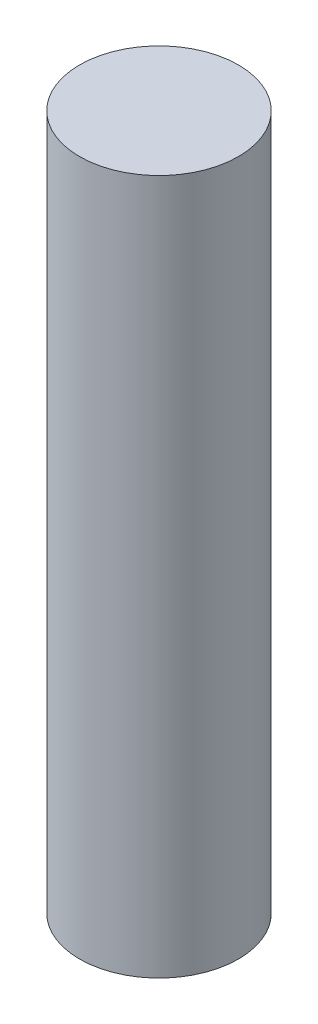
ISO-10303-21;
HEADER;
FILE_DESCRIPTION(('STEP AP214'),'2;1');
FILE_NAME('part.step','',(''),(''),'','','');
FILE_SCHEMA(('AUTOMOTIVE_DESIGN { 1 0 10303 214 1 1 1 1 }'));
ENDSEC;
DATA;
#1=APPLICATION_CONTEXT('core data for automotive mechanical design processes');
#2=APPLICATION_PROTOCOL_DEFINITION('international standard','automotive_design',2000,#1);
#3=PRODUCT_CONTEXT('',#1,'mechanical');
#4=PRODUCT('Part','Part','',(#3));
#5=PRODUCT_RELATED_PRODUCT_CATEGORY('part','',(#4));
#6=PRODUCT_DEFINITION_FORMATION('','',#4);
#7=PRODUCT_DEFINITION_CONTEXT('part definition',#1,'design');
#8=PRODUCT_DEFINITION('design','',#6,#7);
#9=PRODUCT_DEFINITION_SHAPE('','',#8);
#10=(LENGTH_UNIT() NAMED_UNIT(*) SI_UNIT(.MILLI.,.METRE.));
#11=(NAMED_UNIT(*) PLANE_ANGLE_UNIT() SI_UNIT($,.RADIAN.));
#12=(NAMED_UNIT(*) SI_UNIT($,.STERADIAN.) SOLID_ANGLE_UNIT());
#13=UNCERTAINTY_MEASURE_WITH_UNIT(LENGTH_MEASURE(1.E-05),#10,'distance_accuracy_value','');
#14=(GEOMETRIC_REPRESENTATION_CONTEXT(3) GLOBAL_UNCERTAINTY_ASSIGNED_CONTEXT((#13)) GLOBAL_UNIT_ASSIGNED_CONTEXT((#10,
#11,#12)) REPRESENTATION_CONTEXT('',''));
#15=CARTESIAN_POINT('',(0.,0.,0.));
#16=DIRECTION('',(0.,0.,1.));
#17=DIRECTION('',(1.,0.,0.));
#18=AXIS2_PLACEMENT_3D('',#15,#16,#17);
#19=CARTESIAN_POINT('',(0.,35.,0.));
#20=DIRECTION('',(0.,-1.,0.));
#21=DIRECTION('',(0.,0.,-1.));
#22=AXIS2_PLACEMENT_3D('',#19,#20,#21);
#23=CYLINDRICAL_SURFACE('',#22,4.);
#24=CARTESIAN_POINT('',(0.,35.,0.));
#25=DIRECTION('',(0.,1.,0.));
#26=DIRECTION('',(0.,0.,1.));
#27=AXIS2_PLACEMENT_3D('',#24,#25,#26);
#28=CIRCLE('',#27,4.);
#29=CARTESIAN_POINT('',(0.,35.,4.));
#30=VERTEX_POINT('',#29);
#31=EDGE_CURVE('E10',#30,#30,#28,.T.);
#32=ORIENTED_EDGE('',*,*,#31,.F.);
#33=EDGE_LOOP('',(#32));
#34=FACE_BOUND('',#33,.T.);
#35=CARTESIAN_POINT('',(0.,0.,0.));
#36=DIRECTION('',(0.,1.,0.));
#37=DIRECTION('',(0.,0.,1.));
#38=AXIS2_PLACEMENT_3D('',#35,#36,#37);
#39=CIRCLE('',#38,4.);
#40=CARTESIAN_POINT('',(0.,0.,4.));
#41=VERTEX_POINT('',#40);
#42=EDGE_CURVE('E40',#41,#41,#39,.T.);
#43=ORIENTED_EDGE('',*,*,#42,.T.);
#44=EDGE_LOOP('',(#43));
#45=FACE_BOUND('',#44,.T.);
#46=ADVANCED_FACE('F37',(#34,#45),#23,.T.);
#47=CARTESIAN_POINT('',(0.,35.,0.));
#48=DIRECTION('',(0.,1.,0.));
#49=DIRECTION('',(0.,0.,1.));
#50=AXIS2_PLACEMENT_3D('',#47,#48,#49);
#51=PLANE('',#50);
#52=ORIENTED_EDGE('',*,*,#31,.T.);
#53=EDGE_LOOP('',(#52));
#54=FACE_BOUND('',#53,.T.);
#55=ADVANCED_FACE('F54',(#54),#51,.T.);
#56=CARTESIAN_POINT('',(0.,0.,0.));
#57=DIRECTION('',(0.,1.,0.));
#58=DIRECTION('',(0.,0.,1.));
#59=AXIS2_PLACEMENT_3D('',#56,#57,#58);
#60=PLANE('',#59);
#61=ORIENTED_EDGE('',*,*,#42,.F.);
#62=EDGE_LOOP('',(#61));
#63=FACE_BOUND('',#62,.T.);
#64=ADVANCED_FACE('F52',(#63),#60,.F.);
#65=CLOSED_SHELL('',(#46,#55,#64));
#66=MANIFOLD_SOLID_BREP('B2',#65);
#67=ADVANCED_BREP_SHAPE_REPRESENTATION('',(#18,#66),#14);
#68=SHAPE_DEFINITION_REPRESENTATION(#9,#67);
ENDSEC;
END-ISO-10303-21;
